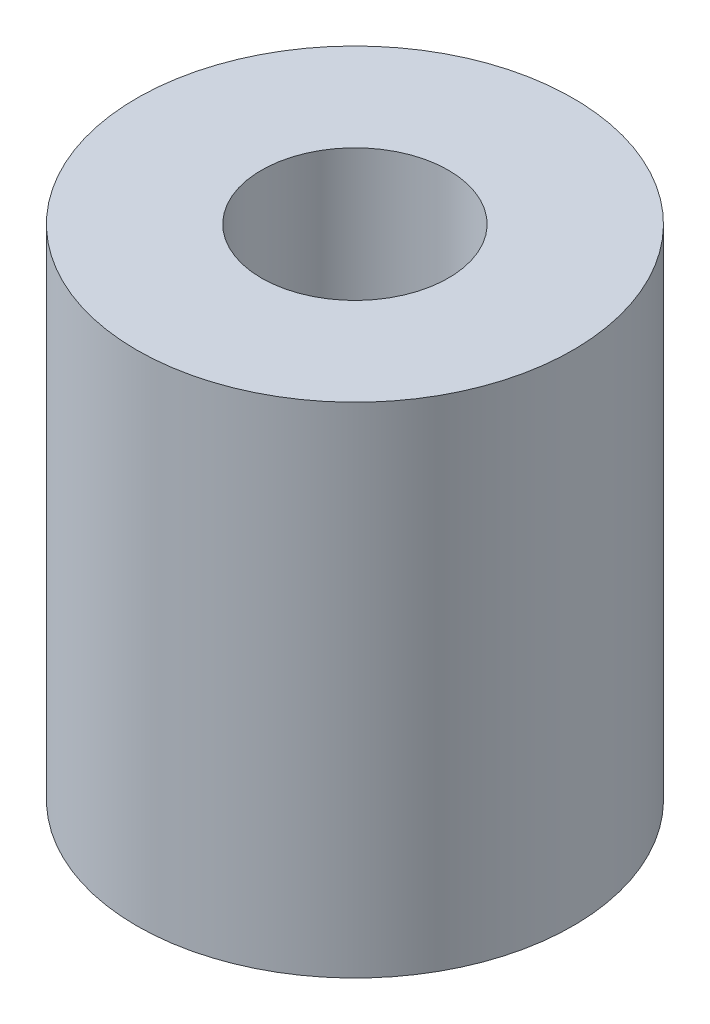
ISO-10303-21;
HEADER;
FILE_DESCRIPTION(('STEP AP214'),'2;1');
FILE_NAME('part.step','',(''),(''),'','','');
FILE_SCHEMA(('AUTOMOTIVE_DESIGN { 1 0 10303 214 1 1 1 1 }'));
ENDSEC;
DATA;
#1=APPLICATION_CONTEXT('core data for automotive mechanical design processes');
#2=APPLICATION_PROTOCOL_DEFINITION('international standard','automotive_design',2000,#1);
#3=PRODUCT_CONTEXT('',#1,'mechanical');
#4=PRODUCT('Part','Part','',(#3));
#5=PRODUCT_RELATED_PRODUCT_CATEGORY('part','',(#4));
#6=PRODUCT_DEFINITION_FORMATION('','',#4);
#7=PRODUCT_DEFINITION_CONTEXT('part definition',#1,'design');
#8=PRODUCT_DEFINITION('design','',#6,#7);
#9=PRODUCT_DEFINITION_SHAPE('','',#8);
#10=(LENGTH_UNIT() NAMED_UNIT(*) SI_UNIT(.MILLI.,.METRE.));
#11=(NAMED_UNIT(*) PLANE_ANGLE_UNIT() SI_UNIT($,.RADIAN.));
#12=(NAMED_UNIT(*) SI_UNIT($,.STERADIAN.) SOLID_ANGLE_UNIT());
#13=UNCERTAINTY_MEASURE_WITH_UNIT(LENGTH_MEASURE(1.E-05),#10,'distance_accuracy_value','');
#14=(GEOMETRIC_REPRESENTATION_CONTEXT(3) GLOBAL_UNCERTAINTY_ASSIGNED_CONTEXT((#13)) GLOBAL_UNIT_ASSIGNED_CONTEXT((#10,
#11,#12)) REPRESENTATION_CONTEXT('',''));
#15=CARTESIAN_POINT('',(0.,0.,0.));
#16=DIRECTION('',(0.,0.,1.));
#17=DIRECTION('',(1.,0.,0.));
#18=AXIS2_PLACEMENT_3D('',#15,#16,#17);
#19=CARTESIAN_POINT('',(0.,8.,0.));
#20=DIRECTION('',(0.,-1.,0.));
#21=DIRECTION('',(0.,0.,-1.));
#22=AXIS2_PLACEMENT_3D('',#19,#20,#21);
#23=CYLINDRICAL_SURFACE('',#22,3.5);
#24=CARTESIAN_POINT('',(0.,8.,0.));
#25=DIRECTION('',(0.,1.,0.));
#26=DIRECTION('',(0.,0.,1.));
#27=AXIS2_PLACEMENT_3D('',#24,#25,#26);
#28=CIRCLE('',#27,3.5);
#29=CARTESIAN_POINT('',(0.,8.,3.5));
#30=VERTEX_POINT('',#29);
#31=EDGE_CURVE('E10',#30,#30,#28,.T.);
#32=ORIENTED_EDGE('',*,*,#31,.F.);
#33=EDGE_LOOP('',(#32));
#34=FACE_BOUND('',#33,.T.);
#35=CARTESIAN_POINT('',(0.,0.,0.));
#36=DIRECTION('',(0.,1.,0.));
#37=DIRECTION('',(0.,0.,1.));
#38=AXIS2_PLACEMENT_3D('',#35,#36,#37);
#39=CIRCLE('',#38,3.5);
#40=CARTESIAN_POINT('',(0.,0.,3.5));
#41=VERTEX_POINT('',#40);
#42=EDGE_CURVE('E33',#41,#41,#39,.T.);
#43=ORIENTED_EDGE('',*,*,#42,.T.);
#44=EDGE_LOOP('',(#43));
#45=FACE_BOUND('',#44,.T.);
#46=ADVANCED_FACE('F30',(#34,#45),#23,.T.);
#47=CARTESIAN_POINT('',(0.,8.,0.));
#48=DIRECTION('',(0.,1.,0.));
#49=DIRECTION('',(0.,0.,1.));
#50=AXIS2_PLACEMENT_3D('',#47,#48,#49);
#51=PLANE('',#50);
#52=CARTESIAN_POINT('',(0.,8.,0.));
#53=DIRECTION('',(0.,1.,0.));
#54=DIRECTION('',(0.,0.,1.));
#55=AXIS2_PLACEMENT_3D('',#52,#53,#54);
#56=CIRCLE('',#55,1.5);
#57=CARTESIAN_POINT('',(0.,8.,1.5));
#58=VERTEX_POINT('',#57);
#59=EDGE_CURVE('E42',#58,#58,#56,.T.);
#60=ORIENTED_EDGE('',*,*,#59,.F.);
#61=EDGE_LOOP('',(#60));
#62=FACE_BOUND('',#61,.T.);
#63=ORIENTED_EDGE('',*,*,#31,.T.);
#64=EDGE_LOOP('',(#63));
#65=FACE_BOUND('',#64,.T.);
#66=ADVANCED_FACE('F57',(#62,#65),#51,.T.);
#67=CARTESIAN_POINT('',(0.,0.,0.));
#68=DIRECTION('',(0.,1.,0.));
#69=DIRECTION('',(0.,0.,1.));
#70=AXIS2_PLACEMENT_3D('',#67,#68,#69);
#71=PLANE('',#70);
#72=CARTESIAN_POINT('',(0.,0.,0.));
#73=DIRECTION('',(0.,1.,0.));
#74=DIRECTION('',(0.,0.,1.));
#75=AXIS2_PLACEMENT_3D('',#72,#73,#74);
#76=CIRCLE('',#75,1.5);
#77=CARTESIAN_POINT('',(0.,0.,1.5));
#78=VERTEX_POINT('',#77);
#79=EDGE_CURVE('E40',#78,#78,#76,.T.);
#80=ORIENTED_EDGE('',*,*,#79,.T.);
#81=EDGE_LOOP('',(#80));
#82=FACE_BOUND('',#81,.T.);
#83=ORIENTED_EDGE('',*,*,#42,.F.);
#84=EDGE_LOOP('',(#83));
#85=FACE_BOUND('',#84,.T.);
#86=ADVANCED_FACE('F48',(#82,#85),#71,.F.);
#87=CARTESIAN_POINT('',(0.,0.,0.));
#88=DIRECTION('',(0.,1.,0.));
#89=DIRECTION('',(0.,0.,1.));
#90=AXIS2_PLACEMENT_3D('',#87,#88,#89);
#91=CYLINDRICAL_SURFACE('',#90,1.5);
#92=ORIENTED_EDGE('',*,*,#79,.F.);
#93=EDGE_LOOP('',(#92));
#94=FACE_BOUND('',#93,.T.);
#95=ORIENTED_EDGE('',*,*,#59,.T.);
#96=EDGE_LOOP('',(#95));
#97=FACE_BOUND('',#96,.T.);
#98=ADVANCED_FACE('F51',(#94,#97),#91,.F.);
#99=CLOSED_SHELL('',(#46,#66,#86,#98));
#100=MANIFOLD_SOLID_BREP('B2',#99);
#101=ADVANCED_BREP_SHAPE_REPRESENTATION('',(#18,#100),#14);
#102=SHAPE_DEFINITION_REPRESENTATION(#9,#101);
ENDSEC;
END-ISO-10303-21;
